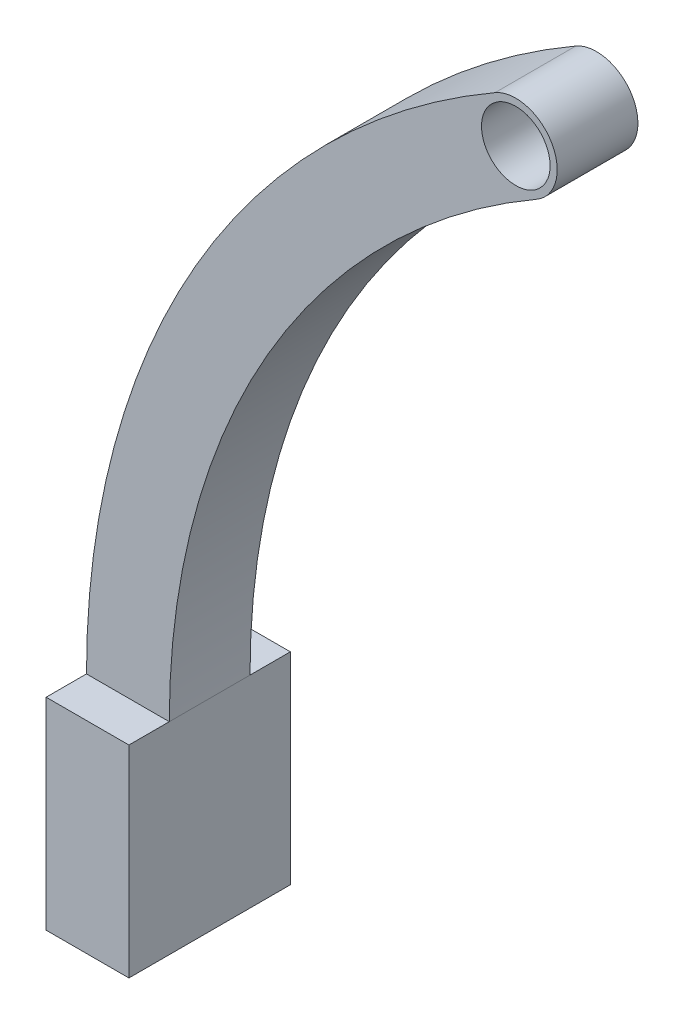
ISO-10303-21;
HEADER;
FILE_DESCRIPTION(('STEP AP214'),'2;1');
FILE_NAME('part.step','',(''),(''),'','','');
FILE_SCHEMA(('AUTOMOTIVE_DESIGN { 1 0 10303 214 1 1 1 1 }'));
ENDSEC;
DATA;
#1=APPLICATION_CONTEXT('core data for automotive mechanical design processes');
#2=APPLICATION_PROTOCOL_DEFINITION('international standard','automotive_design',2000,#1);
#3=PRODUCT_CONTEXT('',#1,'mechanical');
#4=PRODUCT('Part','Part','',(#3));
#5=PRODUCT_RELATED_PRODUCT_CATEGORY('part','',(#4));
#6=PRODUCT_DEFINITION_FORMATION('','',#4);
#7=PRODUCT_DEFINITION_CONTEXT('part definition',#1,'design');
#8=PRODUCT_DEFINITION('design','',#6,#7);
#9=PRODUCT_DEFINITION_SHAPE('','',#8);
#10=(LENGTH_UNIT() NAMED_UNIT(*) SI_UNIT(.MILLI.,.METRE.));
#11=(NAMED_UNIT(*) PLANE_ANGLE_UNIT() SI_UNIT($,.RADIAN.));
#12=(NAMED_UNIT(*) SI_UNIT($,.STERADIAN.) SOLID_ANGLE_UNIT());
#13=UNCERTAINTY_MEASURE_WITH_UNIT(LENGTH_MEASURE(1.E-05),#10,'distance_accuracy_value','');
#14=(GEOMETRIC_REPRESENTATION_CONTEXT(3) GLOBAL_UNCERTAINTY_ASSIGNED_CONTEXT((#13)) GLOBAL_UNIT_ASSIGNED_CONTEXT((#10,
#11,#12)) REPRESENTATION_CONTEXT('',''));
#15=CARTESIAN_POINT('',(0.,0.,0.));
#16=DIRECTION('',(0.,0.,1.));
#17=DIRECTION('',(1.,0.,0.));
#18=AXIS2_PLACEMENT_3D('',#15,#16,#17);
#19=CARTESIAN_POINT('',(0.,0.,40.));
#20=DIRECTION('',(0.,0.,-1.));
#21=DIRECTION('',(-1.,0.,0.));
#22=AXIS2_PLACEMENT_3D('',#19,#20,#21);
#23=CYLINDRICAL_SURFACE('',#22,363.972250429763);
#24=CARTESIAN_POINT('',(0.,0.,0.));
#25=DIRECTION('',(0.,0.,1.));
#26=DIRECTION('',(1.,0.,0.));
#27=AXIS2_PLACEMENT_3D('',#24,#25,#26);
#28=CIRCLE('',#27,363.972250429763);
#29=CARTESIAN_POINT('',(-181.986125214882,315.209215144766,0.));
#30=VERTEX_POINT('',#29);
#31=CARTESIAN_POINT('',(-363.972250429763,0.,0.));
#32=VERTEX_POINT('',#31);
#33=EDGE_CURVE('E196',#30,#32,#28,.T.);
#34=ORIENTED_EDGE('',*,*,#33,.F.);
#35=DIRECTION('',(0.,0.,-1.));
#36=VECTOR('',#35,1.);
#37=CARTESIAN_POINT('',(-181.986125214882,315.209215144766,40.));
#38=LINE('',#37,#36);
#39=CARTESIAN_POINT('',(-181.986125214882,315.209215144766,40.));
#40=VERTEX_POINT('',#39);
#41=EDGE_CURVE('E11',#40,#30,#38,.T.);
#42=ORIENTED_EDGE('',*,*,#41,.F.);
#43=CARTESIAN_POINT('',(0.,0.,40.));
#44=DIRECTION('',(0.,0.,1.));
#45=DIRECTION('',(1.,0.,0.));
#46=AXIS2_PLACEMENT_3D('',#43,#44,#45);
#47=CIRCLE('',#46,363.972250429763);
#48=CARTESIAN_POINT('',(-363.972250429763,0.,40.));
#49=VERTEX_POINT('',#48);
#50=EDGE_CURVE('E56',#40,#49,#47,.T.);
#51=ORIENTED_EDGE('',*,*,#50,.T.);
#52=DIRECTION('',(0.,0.,-1.));
#53=VECTOR('',#52,1.);
#54=CARTESIAN_POINT('',(-363.972250429763,0.,40.));
#55=LINE('',#54,#53);
#56=EDGE_CURVE('E77',#49,#32,#55,.T.);
#57=ORIENTED_EDGE('',*,*,#56,.T.);
#58=EDGE_LOOP('',(#34,#42,#51,#57));
#59=FACE_BOUND('',#58,.T.);
#60=ADVANCED_FACE('F37',(#59),#23,.F.);
#61=CARTESIAN_POINT('',(-192.243062607441,332.974751838732,40.));
#62=DIRECTION('',(0.,0.,-1.));
#63=DIRECTION('',(-1.,0.,0.));
#64=AXIS2_PLACEMENT_3D('',#61,#62,#63);
#65=CYLINDRICAL_SURFACE('',#64,20.5138747851183);
#66=CARTESIAN_POINT('',(-192.243062607441,332.974751838732,0.));
#67=DIRECTION('',(0.,0.,1.));
#68=DIRECTION('',(1.,0.,0.));
#69=AXIS2_PLACEMENT_3D('',#66,#67,#68);
#70=CIRCLE('',#69,20.5138747851183);
#71=CARTESIAN_POINT('',(-202.500000000001,350.740288532697,0.));
#72=VERTEX_POINT('',#71);
#73=EDGE_CURVE('E198',#30,#72,#70,.T.);
#74=ORIENTED_EDGE('',*,*,#73,.T.);
#75=DIRECTION('',(0.,0.,-1.));
#76=VECTOR('',#75,1.);
#77=CARTESIAN_POINT('',(-202.500000000001,350.740288532697,40.));
#78=LINE('',#77,#76);
#79=CARTESIAN_POINT('',(-202.500000000001,350.740288532697,40.));
#80=VERTEX_POINT('',#79);
#81=EDGE_CURVE('E47',#80,#72,#78,.T.);
#82=ORIENTED_EDGE('',*,*,#81,.F.);
#83=CARTESIAN_POINT('',(-192.243062607441,332.974751838732,40.));
#84=DIRECTION('',(0.,0.,1.));
#85=DIRECTION('',(1.,0.,0.));
#86=AXIS2_PLACEMENT_3D('',#83,#84,#85);
#87=CIRCLE('',#86,20.5138747851183);
#88=EDGE_CURVE('E192',#40,#80,#87,.T.);
#89=ORIENTED_EDGE('',*,*,#88,.F.);
#90=ORIENTED_EDGE('',*,*,#41,.T.);
#91=EDGE_LOOP('',(#74,#82,#89,#90));
#92=FACE_BOUND('',#91,.T.);
#93=ADVANCED_FACE('F226',(#92),#65,.T.);
#94=CARTESIAN_POINT('',(0.,0.,40.));
#95=DIRECTION('',(0.,0.,-1.));
#96=DIRECTION('',(-1.,0.,0.));
#97=AXIS2_PLACEMENT_3D('',#94,#95,#96);
#98=CYLINDRICAL_SURFACE('',#97,405.);
#99=CARTESIAN_POINT('',(0.,0.,0.));
#100=DIRECTION('',(0.,0.,1.));
#101=DIRECTION('',(1.,0.,0.));
#102=AXIS2_PLACEMENT_3D('',#99,#100,#101);
#103=CIRCLE('',#102,405.);
#104=CARTESIAN_POINT('',(-405.,0.,0.));
#105=VERTEX_POINT('',#104);
#106=EDGE_CURVE('E73',#72,#105,#103,.T.);
#107=ORIENTED_EDGE('',*,*,#106,.T.);
#108=DIRECTION('',(0.,0.,-1.));
#109=VECTOR('',#108,1.);
#110=CARTESIAN_POINT('',(-405.,0.,40.));
#111=LINE('',#110,#109);
#112=CARTESIAN_POINT('',(-405.,0.,40.));
#113=VERTEX_POINT('',#112);
#114=EDGE_CURVE('E172',#113,#105,#111,.T.);
#115=ORIENTED_EDGE('',*,*,#114,.F.);
#116=CARTESIAN_POINT('',(0.,0.,40.));
#117=DIRECTION('',(0.,0.,1.));
#118=DIRECTION('',(1.,0.,0.));
#119=AXIS2_PLACEMENT_3D('',#116,#117,#118);
#120=CIRCLE('',#119,405.);
#121=EDGE_CURVE('E183',#80,#113,#120,.T.);
#122=ORIENTED_EDGE('',*,*,#121,.F.);
#123=ORIENTED_EDGE('',*,*,#81,.T.);
#124=EDGE_LOOP('',(#107,#115,#122,#123));
#125=FACE_BOUND('',#124,.T.);
#126=ADVANCED_FACE('F218',(#125),#98,.T.);
#127=CARTESIAN_POINT('',(-192.243062607441,332.974751838732,40.));
#128=DIRECTION('',(0.,0.,-1.));
#129=DIRECTION('',(-1.,0.,0.));
#130=AXIS2_PLACEMENT_3D('',#127,#128,#129);
#131=CYLINDRICAL_SURFACE('',#130,17.);
#132=CARTESIAN_POINT('',(-192.243062607441,332.974751838732,40.));
#133=DIRECTION('',(0.,0.,1.));
#134=DIRECTION('',(1.,0.,0.));
#135=AXIS2_PLACEMENT_3D('',#132,#133,#134);
#136=CIRCLE('',#135,17.);
#137=CARTESIAN_POINT('',(-175.243062607441,332.974751838732,40.));
#138=VERTEX_POINT('',#137);
#139=EDGE_CURVE('E193',#138,#138,#136,.T.);
#140=ORIENTED_EDGE('',*,*,#139,.T.);
#141=EDGE_LOOP('',(#140));
#142=FACE_BOUND('',#141,.T.);
#143=CARTESIAN_POINT('',(-192.243062607441,332.974751838732,0.));
#144=DIRECTION('',(0.,0.,1.));
#145=DIRECTION('',(1.,0.,0.));
#146=AXIS2_PLACEMENT_3D('',#143,#144,#145);
#147=CIRCLE('',#146,17.);
#148=CARTESIAN_POINT('',(-175.243062607441,332.974751838732,0.));
#149=VERTEX_POINT('',#148);
#150=EDGE_CURVE('E160',#149,#149,#147,.T.);
#151=ORIENTED_EDGE('',*,*,#150,.F.);
#152=EDGE_LOOP('',(#151));
#153=FACE_BOUND('',#152,.T.);
#154=ADVANCED_FACE('F39',(#142,#153),#131,.F.);
#155=CARTESIAN_POINT('',(0.,0.,40.));
#156=DIRECTION('',(0.,0.,1.));
#157=DIRECTION('',(1.,0.,0.));
#158=AXIS2_PLACEMENT_3D('',#155,#156,#157);
#159=PLANE('',#158);
#160=ORIENTED_EDGE('',*,*,#139,.F.);
#161=EDGE_LOOP('',(#160));
#162=FACE_BOUND('',#161,.T.);
#163=ORIENTED_EDGE('',*,*,#50,.F.);
#164=ORIENTED_EDGE('',*,*,#88,.T.);
#165=ORIENTED_EDGE('',*,*,#121,.T.);
#166=DIRECTION('',(-1.,0.,0.));
#167=VECTOR('',#166,1.);
#168=CARTESIAN_POINT('',(0.,0.,40.));
#169=LINE('',#168,#167);
#170=EDGE_CURVE('E115',#49,#113,#169,.T.);
#171=ORIENTED_EDGE('',*,*,#170,.F.);
#172=EDGE_LOOP('',(#163,#164,#165,#171));
#173=FACE_BOUND('',#172,.T.);
#174=ADVANCED_FACE('F217',(#162,#173),#159,.T.);
#175=CARTESIAN_POINT('',(0.,0.,0.));
#176=DIRECTION('',(0.,0.,1.));
#177=DIRECTION('',(1.,0.,0.));
#178=AXIS2_PLACEMENT_3D('',#175,#176,#177);
#179=PLANE('',#178);
#180=ORIENTED_EDGE('',*,*,#150,.T.);
#181=EDGE_LOOP('',(#180));
#182=FACE_BOUND('',#181,.T.);
#183=ORIENTED_EDGE('',*,*,#33,.T.);
#184=DIRECTION('',(-1.,0.,0.));
#185=VECTOR('',#184,1.);
#186=CARTESIAN_POINT('',(0.,0.,0.));
#187=LINE('',#186,#185);
#188=EDGE_CURVE('E169',#32,#105,#187,.T.);
#189=ORIENTED_EDGE('',*,*,#188,.T.);
#190=ORIENTED_EDGE('',*,*,#106,.F.);
#191=ORIENTED_EDGE('',*,*,#73,.F.);
#192=EDGE_LOOP('',(#183,#189,#190,#191));
#193=FACE_BOUND('',#192,.T.);
#194=ADVANCED_FACE('F213',(#182,#193),#179,.F.);
#195=CARTESIAN_POINT('',(-363.972250429763,0.,-20.));
#196=DIRECTION('',(0.,1.,0.));
#197=DIRECTION('',(0.,0.,1.));
#198=AXIS2_PLACEMENT_3D('',#195,#196,#197);
#199=PLANE('',#198);
#200=ORIENTED_EDGE('',*,*,#188,.F.);
#201=DIRECTION('',(0.,0.,1.));
#202=VECTOR('',#201,1.);
#203=CARTESIAN_POINT('',(-363.972250429763,0.,-20.));
#204=LINE('',#203,#202);
#205=CARTESIAN_POINT('',(-363.972250429763,0.,-20.));
#206=VERTEX_POINT('',#205);
#207=EDGE_CURVE('E158',#206,#32,#204,.T.);
#208=ORIENTED_EDGE('',*,*,#207,.F.);
#209=DIRECTION('',(-1.,0.,0.));
#210=VECTOR('',#209,1.);
#211=CARTESIAN_POINT('',(-363.972250429763,0.,-20.));
#212=LINE('',#211,#210);
#213=CARTESIAN_POINT('',(-405.,0.,-20.));
#214=VERTEX_POINT('',#213);
#215=EDGE_CURVE('E139',#206,#214,#212,.T.);
#216=ORIENTED_EDGE('',*,*,#215,.T.);
#217=DIRECTION('',(0.,0.,1.));
#218=VECTOR('',#217,1.);
#219=CARTESIAN_POINT('',(-405.,0.,-20.));
#220=LINE('',#219,#218);
#221=EDGE_CURVE('E118',#214,#105,#220,.T.);
#222=ORIENTED_EDGE('',*,*,#221,.T.);
#223=EDGE_LOOP('',(#200,#208,#216,#222));
#224=FACE_BOUND('',#223,.T.);
#225=ADVANCED_FACE('F168',(#224),#199,.T.);
#226=CARTESIAN_POINT('',(-363.972250429763,0.,60.));
#227=VERTEX_POINT('',#226);
#228=EDGE_CURVE('E155',#49,#227,#204,.T.);
#229=ORIENTED_EDGE('',*,*,#228,.F.);
#230=ORIENTED_EDGE('',*,*,#170,.T.);
#231=CARTESIAN_POINT('',(-405.,0.,60.));
#232=VERTEX_POINT('',#231);
#233=EDGE_CURVE('E109',#113,#232,#220,.T.);
#234=ORIENTED_EDGE('',*,*,#233,.T.);
#235=DIRECTION('',(-1.,0.,0.));
#236=VECTOR('',#235,1.);
#237=CARTESIAN_POINT('',(-363.972250429763,0.,60.));
#238=LINE('',#237,#236);
#239=EDGE_CURVE('E114',#227,#232,#238,.T.);
#240=ORIENTED_EDGE('',*,*,#239,.F.);
#241=EDGE_LOOP('',(#229,#230,#234,#240));
#242=FACE_BOUND('',#241,.T.);
#243=ADVANCED_FACE('F112',(#242),#199,.T.);
#244=CARTESIAN_POINT('',(-363.972250429763,-100.,-20.));
#245=DIRECTION('',(1.,0.,0.));
#246=DIRECTION('',(0.,0.,-1.));
#247=AXIS2_PLACEMENT_3D('',#244,#245,#246);
#248=PLANE('',#247);
#249=ORIENTED_EDGE('',*,*,#207,.T.);
#250=ORIENTED_EDGE('',*,*,#56,.F.);
#251=ORIENTED_EDGE('',*,*,#228,.T.);
#252=DIRECTION('',(0.,1.,0.));
#253=VECTOR('',#252,1.);
#254=CARTESIAN_POINT('',(-363.972250429763,-100.,60.));
#255=LINE('',#254,#253);
#256=CARTESIAN_POINT('',(-363.972250429763,-100.,60.));
#257=VERTEX_POINT('',#256);
#258=EDGE_CURVE('E134',#257,#227,#255,.T.);
#259=ORIENTED_EDGE('',*,*,#258,.F.);
#260=DIRECTION('',(0.,0.,1.));
#261=VECTOR('',#260,1.);
#262=CARTESIAN_POINT('',(-363.972250429763,-100.,-20.));
#263=LINE('',#262,#261);
#264=CARTESIAN_POINT('',(-363.972250429763,-100.,-20.));
#265=VERTEX_POINT('',#264);
#266=EDGE_CURVE('E151',#265,#257,#263,.T.);
#267=ORIENTED_EDGE('',*,*,#266,.F.);
#268=DIRECTION('',(0.,1.,0.));
#269=VECTOR('',#268,1.);
#270=CARTESIAN_POINT('',(-363.972250429763,-100.,-20.));
#271=LINE('',#270,#269);
#272=EDGE_CURVE('E119',#265,#206,#271,.T.);
#273=ORIENTED_EDGE('',*,*,#272,.T.);
#274=EDGE_LOOP('',(#249,#250,#251,#259,#267,#273));
#275=FACE_BOUND('',#274,.T.);
#276=ADVANCED_FACE('F180',(#275),#248,.T.);
#277=CARTESIAN_POINT('',(-405.,-100.,-20.));
#278=DIRECTION('',(0.,-1.,0.));
#279=DIRECTION('',(0.,0.,-1.));
#280=AXIS2_PLACEMENT_3D('',#277,#278,#279);
#281=PLANE('',#280);
#282=ORIENTED_EDGE('',*,*,#266,.T.);
#283=DIRECTION('',(1.,0.,0.));
#284=VECTOR('',#283,1.);
#285=CARTESIAN_POINT('',(-405.,-100.,60.));
#286=LINE('',#285,#284);
#287=CARTESIAN_POINT('',(-405.,-100.,60.));
#288=VERTEX_POINT('',#287);
#289=EDGE_CURVE('E129',#288,#257,#286,.T.);
#290=ORIENTED_EDGE('',*,*,#289,.F.);
#291=DIRECTION('',(0.,0.,1.));
#292=VECTOR('',#291,1.);
#293=CARTESIAN_POINT('',(-405.,-100.,-20.));
#294=LINE('',#293,#292);
#295=CARTESIAN_POINT('',(-405.,-100.,-20.));
#296=VERTEX_POINT('',#295);
#297=EDGE_CURVE('E125',#296,#288,#294,.T.);
#298=ORIENTED_EDGE('',*,*,#297,.F.);
#299=DIRECTION('',(1.,0.,0.));
#300=VECTOR('',#299,1.);
#301=CARTESIAN_POINT('',(-405.,-100.,-20.));
#302=LINE('',#301,#300);
#303=EDGE_CURVE('E144',#296,#265,#302,.T.);
#304=ORIENTED_EDGE('',*,*,#303,.T.);
#305=EDGE_LOOP('',(#282,#290,#298,#304));
#306=FACE_BOUND('',#305,.T.);
#307=ADVANCED_FACE('F178',(#306),#281,.T.);
#308=CARTESIAN_POINT('',(-405.,0.,-20.));
#309=DIRECTION('',(-1.,0.,0.));
#310=DIRECTION('',(0.,0.,1.));
#311=AXIS2_PLACEMENT_3D('',#308,#309,#310);
#312=PLANE('',#311);
#313=ORIENTED_EDGE('',*,*,#297,.T.);
#314=DIRECTION('',(0.,-1.,0.));
#315=VECTOR('',#314,1.);
#316=CARTESIAN_POINT('',(-405.,0.,60.));
#317=LINE('',#316,#315);
#318=EDGE_CURVE('E122',#232,#288,#317,.T.);
#319=ORIENTED_EDGE('',*,*,#318,.F.);
#320=ORIENTED_EDGE('',*,*,#233,.F.);
#321=ORIENTED_EDGE('',*,*,#114,.T.);
#322=ORIENTED_EDGE('',*,*,#221,.F.);
#323=DIRECTION('',(0.,-1.,0.));
#324=VECTOR('',#323,1.);
#325=CARTESIAN_POINT('',(-405.,0.,-20.));
#326=LINE('',#325,#324);
#327=EDGE_CURVE('E142',#214,#296,#326,.T.);
#328=ORIENTED_EDGE('',*,*,#327,.T.);
#329=EDGE_LOOP('',(#313,#319,#320,#321,#322,#328));
#330=FACE_BOUND('',#329,.T.);
#331=ADVANCED_FACE('F123',(#330),#312,.T.);
#332=CARTESIAN_POINT('',(0.,0.,-20.));
#333=DIRECTION('',(0.,0.,1.));
#334=DIRECTION('',(1.,0.,0.));
#335=AXIS2_PLACEMENT_3D('',#332,#333,#334);
#336=PLANE('',#335);
#337=ORIENTED_EDGE('',*,*,#215,.F.);
#338=ORIENTED_EDGE('',*,*,#272,.F.);
#339=ORIENTED_EDGE('',*,*,#303,.F.);
#340=ORIENTED_EDGE('',*,*,#327,.F.);
#341=EDGE_LOOP('',(#337,#338,#339,#340));
#342=FACE_BOUND('',#341,.T.);
#343=ADVANCED_FACE('F175',(#342),#336,.F.);
#344=CARTESIAN_POINT('',(0.,0.,60.));
#345=DIRECTION('',(0.,0.,1.));
#346=DIRECTION('',(1.,0.,0.));
#347=AXIS2_PLACEMENT_3D('',#344,#345,#346);
#348=PLANE('',#347);
#349=ORIENTED_EDGE('',*,*,#239,.T.);
#350=ORIENTED_EDGE('',*,*,#318,.T.);
#351=ORIENTED_EDGE('',*,*,#289,.T.);
#352=ORIENTED_EDGE('',*,*,#258,.T.);
#353=EDGE_LOOP('',(#349,#350,#351,#352));
#354=FACE_BOUND('',#353,.T.);
#355=ADVANCED_FACE('F132',(#354),#348,.T.);
#356=CLOSED_SHELL('',(#60,#93,#126,#154,#174,#194,#225,#243,#276,#307,#331,#343,#355));
#357=MANIFOLD_SOLID_BREP('B2',#356);
#358=ADVANCED_BREP_SHAPE_REPRESENTATION('',(#18,#357),#14);
#359=SHAPE_DEFINITION_REPRESENTATION(#9,#358);
ENDSEC;
END-ISO-10303-21;
